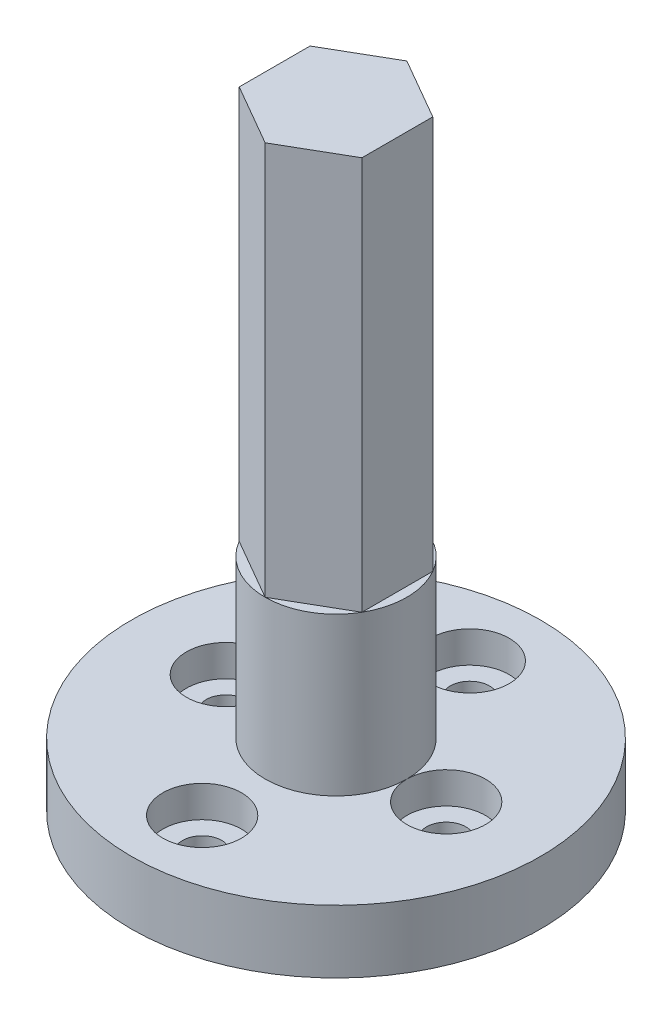
ISO-10303-21;
HEADER;
FILE_DESCRIPTION(('STEP AP214'),'2;1');
FILE_NAME('part.step','',(''),(''),'','','');
FILE_SCHEMA(('AUTOMOTIVE_DESIGN { 1 0 10303 214 1 1 1 1 }'));
ENDSEC;
DATA;
#1=APPLICATION_CONTEXT('core data for automotive mechanical design processes');
#2=APPLICATION_PROTOCOL_DEFINITION('international standard','automotive_design',2000,#1);
#3=PRODUCT_CONTEXT('',#1,'mechanical');
#4=PRODUCT('Part','Part','',(#3));
#5=PRODUCT_RELATED_PRODUCT_CATEGORY('part','',(#4));
#6=PRODUCT_DEFINITION_FORMATION('','',#4);
#7=PRODUCT_DEFINITION_CONTEXT('part definition',#1,'design');
#8=PRODUCT_DEFINITION('design','',#6,#7);
#9=PRODUCT_DEFINITION_SHAPE('','',#8);
#10=(LENGTH_UNIT() NAMED_UNIT(*) SI_UNIT(.MILLI.,.METRE.));
#11=(NAMED_UNIT(*) PLANE_ANGLE_UNIT() SI_UNIT($,.RADIAN.));
#12=(NAMED_UNIT(*) SI_UNIT($,.STERADIAN.) SOLID_ANGLE_UNIT());
#13=UNCERTAINTY_MEASURE_WITH_UNIT(LENGTH_MEASURE(1.E-05),#10,'distance_accuracy_value','');
#14=(GEOMETRIC_REPRESENTATION_CONTEXT(3) GLOBAL_UNCERTAINTY_ASSIGNED_CONTEXT((#13)) GLOBAL_UNIT_ASSIGNED_CONTEXT((#10,
#11,#12)) REPRESENTATION_CONTEXT('',''));
#15=CARTESIAN_POINT('',(0.,0.,0.));
#16=DIRECTION('',(0.,0.,1.));
#17=DIRECTION('',(1.,0.,0.));
#18=AXIS2_PLACEMENT_3D('',#15,#16,#17);
#19=CARTESIAN_POINT('',(0.,39.,0.));
#20=DIRECTION('',(0.,-1.,0.));
#21=DIRECTION('',(0.,0.,-1.));
#22=AXIS2_PLACEMENT_3D('',#19,#20,#21);
#23=CYLINDRICAL_SURFACE('',#22,4.5);
#24=CARTESIAN_POINT('',(0.,4.,0.));
#25=DIRECTION('',(0.,1.,0.));
#26=DIRECTION('',(0.,0.,1.));
#27=AXIS2_PLACEMENT_3D('',#24,#25,#26);
#28=CIRCLE('',#27,4.5);
#29=CARTESIAN_POINT('',(-4.5,4.,0.));
#30=VERTEX_POINT('',#29);
#31=CARTESIAN_POINT('',(4.5,4.,0.));
#32=VERTEX_POINT('',#31);
#33=EDGE_CURVE('E156',#30,#32,#28,.T.);
#34=ORIENTED_EDGE('',*,*,#33,.T.);
#35=EDGE_CURVE('E151',#32,#30,#28,.T.);
#36=ORIENTED_EDGE('',*,*,#35,.T.);
#37=EDGE_LOOP('',(#34,#36));
#38=FACE_BOUND('',#37,.T.);
#39=CARTESIAN_POINT('',(0.,14.,0.));
#40=DIRECTION('',(0.,1.,0.));
#41=DIRECTION('',(0.,0.,1.));
#42=AXIS2_PLACEMENT_3D('',#39,#40,#41);
#43=CIRCLE('',#42,4.5);
#44=CARTESIAN_POINT('',(0.,14.,-4.5));
#45=VERTEX_POINT('',#44);
#46=CARTESIAN_POINT('',(-3.89711431702997,14.,-2.25));
#47=VERTEX_POINT('',#46);
#48=EDGE_CURVE('E12',#45,#47,#43,.T.);
#49=ORIENTED_EDGE('',*,*,#48,.F.);
#50=CARTESIAN_POINT('',(3.89711431702997,14.,-2.25));
#51=VERTEX_POINT('',#50);
#52=EDGE_CURVE('E58',#51,#45,#43,.T.);
#53=ORIENTED_EDGE('',*,*,#52,.F.);
#54=CARTESIAN_POINT('',(3.89711431702997,14.,2.25));
#55=VERTEX_POINT('',#54);
#56=EDGE_CURVE('E117',#55,#51,#43,.T.);
#57=ORIENTED_EDGE('',*,*,#56,.F.);
#58=CARTESIAN_POINT('',(0.,14.,4.5));
#59=VERTEX_POINT('',#58);
#60=EDGE_CURVE('E154',#59,#55,#43,.T.);
#61=ORIENTED_EDGE('',*,*,#60,.F.);
#62=CARTESIAN_POINT('',(-3.89711431702997,14.,2.25));
#63=VERTEX_POINT('',#62);
#64=EDGE_CURVE('E148',#63,#59,#43,.T.);
#65=ORIENTED_EDGE('',*,*,#64,.F.);
#66=EDGE_CURVE('E52',#47,#63,#43,.T.);
#67=ORIENTED_EDGE('',*,*,#66,.F.);
#68=EDGE_LOOP('',(#49,#53,#57,#61,#65,#67));
#69=FACE_BOUND('',#68,.T.);
#70=ADVANCED_FACE('F48',(#38,#69),#23,.T.);
#71=CARTESIAN_POINT('',(0.,4.,0.));
#72=DIRECTION('',(0.,1.,0.));
#73=DIRECTION('',(0.,0.,1.));
#74=AXIS2_PLACEMENT_3D('',#71,#72,#73);
#75=PLANE('',#74);
#76=CARTESIAN_POINT('',(0.,4.,8.5));
#77=DIRECTION('',(0.,1.,0.));
#78=DIRECTION('',(0.,0.,1.));
#79=AXIS2_PLACEMENT_3D('',#76,#77,#78);
#80=CIRCLE('',#79,2.5);
#81=CARTESIAN_POINT('',(0.,4.,11.));
#82=VERTEX_POINT('',#81);
#83=EDGE_CURVE('E201',#82,#82,#80,.F.);
#84=ORIENTED_EDGE('',*,*,#83,.T.);
#85=EDGE_LOOP('',(#84));
#86=FACE_BOUND('',#85,.T.);
#87=CARTESIAN_POINT('',(0.,4.,0.));
#88=DIRECTION('',(0.,1.,0.));
#89=DIRECTION('',(0.,0.,1.));
#90=AXIS2_PLACEMENT_3D('',#87,#88,#89);
#91=CIRCLE('',#90,13.);
#92=CARTESIAN_POINT('',(0.,4.,13.));
#93=VERTEX_POINT('',#92);
#94=EDGE_CURVE('E162',#93,#93,#91,.T.);
#95=ORIENTED_EDGE('',*,*,#94,.T.);
#96=EDGE_LOOP('',(#95));
#97=FACE_BOUND('',#96,.T.);
#98=ORIENTED_EDGE('',*,*,#35,.F.);
#99=CARTESIAN_POINT('',(7.,4.,0.));
#100=DIRECTION('',(0.,1.,0.));
#101=DIRECTION('',(0.,0.,1.));
#102=AXIS2_PLACEMENT_3D('',#99,#100,#101);
#103=CIRCLE('',#102,2.5);
#104=EDGE_CURVE('E165',#32,#32,#103,.F.);
#105=ORIENTED_EDGE('',*,*,#104,.T.);
#106=ORIENTED_EDGE('',*,*,#33,.F.);
#107=CARTESIAN_POINT('',(-7.,4.,0.));
#108=DIRECTION('',(0.,1.,0.));
#109=DIRECTION('',(0.,0.,1.));
#110=AXIS2_PLACEMENT_3D('',#107,#108,#109);
#111=CIRCLE('',#110,2.5);
#112=EDGE_CURVE('E200',#30,#30,#111,.F.);
#113=ORIENTED_EDGE('',*,*,#112,.T.);
#114=EDGE_LOOP('',(#98,#105,#106,#113));
#115=FACE_BOUND('',#114,.T.);
#116=CARTESIAN_POINT('',(0.,4.,-8.5));
#117=DIRECTION('',(0.,1.,0.));
#118=DIRECTION('',(0.,0.,1.));
#119=AXIS2_PLACEMENT_3D('',#116,#117,#118);
#120=CIRCLE('',#119,2.5);
#121=CARTESIAN_POINT('',(0.,4.,-6.));
#122=VERTEX_POINT('',#121);
#123=EDGE_CURVE('E180',#122,#122,#120,.F.);
#124=ORIENTED_EDGE('',*,*,#123,.T.);
#125=EDGE_LOOP('',(#124));
#126=FACE_BOUND('',#125,.T.);
#127=ADVANCED_FACE('F256',(#86,#97,#115,#126),#75,.T.);
#128=CARTESIAN_POINT('',(-7.,39.,0.));
#129=DIRECTION('',(0.,-1.,0.));
#130=DIRECTION('',(0.,0.,-1.));
#131=AXIS2_PLACEMENT_3D('',#128,#129,#130);
#132=CYLINDRICAL_SURFACE('',#131,1.25);
#133=CARTESIAN_POINT('',(-7.,0.,0.));
#134=DIRECTION('',(0.,1.,0.));
#135=DIRECTION('',(0.,0.,1.));
#136=AXIS2_PLACEMENT_3D('',#133,#134,#135);
#137=CIRCLE('',#136,1.25);
#138=CARTESIAN_POINT('',(-7.,0.,1.25));
#139=VERTEX_POINT('',#138);
#140=EDGE_CURVE('E175',#139,#139,#137,.T.);
#141=ORIENTED_EDGE('',*,*,#140,.F.);
#142=EDGE_LOOP('',(#141));
#143=FACE_BOUND('',#142,.T.);
#144=CARTESIAN_POINT('',(-7.,2.,0.));
#145=DIRECTION('',(0.,1.,0.));
#146=DIRECTION('',(0.,0.,1.));
#147=AXIS2_PLACEMENT_3D('',#144,#145,#146);
#148=CIRCLE('',#147,1.25);
#149=CARTESIAN_POINT('',(-7.,2.,1.25));
#150=VERTEX_POINT('',#149);
#151=EDGE_CURVE('E241',#150,#150,#148,.T.);
#152=ORIENTED_EDGE('',*,*,#151,.T.);
#153=EDGE_LOOP('',(#152));
#154=FACE_BOUND('',#153,.T.);
#155=ADVANCED_FACE('F266',(#143,#154),#132,.F.);
#156=CARTESIAN_POINT('',(7.,39.,0.));
#157=DIRECTION('',(0.,-1.,0.));
#158=DIRECTION('',(0.,0.,-1.));
#159=AXIS2_PLACEMENT_3D('',#156,#157,#158);
#160=CYLINDRICAL_SURFACE('',#159,1.25);
#161=CARTESIAN_POINT('',(7.,0.,0.));
#162=DIRECTION('',(0.,1.,0.));
#163=DIRECTION('',(0.,0.,1.));
#164=AXIS2_PLACEMENT_3D('',#161,#162,#163);
#165=CIRCLE('',#164,1.25);
#166=CARTESIAN_POINT('',(7.,0.,1.25));
#167=VERTEX_POINT('',#166);
#168=EDGE_CURVE('E179',#167,#167,#165,.T.);
#169=ORIENTED_EDGE('',*,*,#168,.F.);
#170=EDGE_LOOP('',(#169));
#171=FACE_BOUND('',#170,.T.);
#172=CARTESIAN_POINT('',(7.,2.,0.));
#173=DIRECTION('',(0.,1.,0.));
#174=DIRECTION('',(0.,0.,1.));
#175=AXIS2_PLACEMENT_3D('',#172,#173,#174);
#176=CIRCLE('',#175,1.25);
#177=CARTESIAN_POINT('',(7.,2.,1.25));
#178=VERTEX_POINT('',#177);
#179=EDGE_CURVE('E236',#178,#178,#176,.T.);
#180=ORIENTED_EDGE('',*,*,#179,.T.);
#181=EDGE_LOOP('',(#180));
#182=FACE_BOUND('',#181,.T.);
#183=ADVANCED_FACE('F302',(#171,#182),#160,.F.);
#184=CARTESIAN_POINT('',(0.,39.,-8.5));
#185=DIRECTION('',(0.,-1.,0.));
#186=DIRECTION('',(0.,0.,-1.));
#187=AXIS2_PLACEMENT_3D('',#184,#185,#186);
#188=CYLINDRICAL_SURFACE('',#187,1.25);
#189=CARTESIAN_POINT('',(0.,0.,-8.5));
#190=DIRECTION('',(0.,1.,0.));
#191=DIRECTION('',(0.,0.,1.));
#192=AXIS2_PLACEMENT_3D('',#189,#190,#191);
#193=CIRCLE('',#192,1.25);
#194=CARTESIAN_POINT('',(0.,0.,-7.25));
#195=VERTEX_POINT('',#194);
#196=EDGE_CURVE('E184',#195,#195,#193,.T.);
#197=ORIENTED_EDGE('',*,*,#196,.F.);
#198=EDGE_LOOP('',(#197));
#199=FACE_BOUND('',#198,.T.);
#200=CARTESIAN_POINT('',(0.,2.,-8.5));
#201=DIRECTION('',(0.,1.,0.));
#202=DIRECTION('',(0.,0.,1.));
#203=AXIS2_PLACEMENT_3D('',#200,#201,#202);
#204=CIRCLE('',#203,1.25);
#205=CARTESIAN_POINT('',(0.,2.,-7.25));
#206=VERTEX_POINT('',#205);
#207=EDGE_CURVE('E195',#206,#206,#204,.F.);
#208=ORIENTED_EDGE('',*,*,#207,.F.);
#209=EDGE_LOOP('',(#208));
#210=FACE_BOUND('',#209,.T.);
#211=ADVANCED_FACE('F327',(#199,#210),#188,.F.);
#212=CARTESIAN_POINT('',(0.,39.,8.5));
#213=DIRECTION('',(0.,-1.,0.));
#214=DIRECTION('',(0.,0.,-1.));
#215=AXIS2_PLACEMENT_3D('',#212,#213,#214);
#216=CYLINDRICAL_SURFACE('',#215,1.25);
#217=CARTESIAN_POINT('',(0.,0.,8.5));
#218=DIRECTION('',(0.,1.,0.));
#219=DIRECTION('',(0.,0.,1.));
#220=AXIS2_PLACEMENT_3D('',#217,#218,#219);
#221=CIRCLE('',#220,1.25);
#222=CARTESIAN_POINT('',(0.,0.,9.75));
#223=VERTEX_POINT('',#222);
#224=EDGE_CURVE('E174',#223,#223,#221,.T.);
#225=ORIENTED_EDGE('',*,*,#224,.F.);
#226=EDGE_LOOP('',(#225));
#227=FACE_BOUND('',#226,.T.);
#228=CARTESIAN_POINT('',(0.,2.,8.5));
#229=DIRECTION('',(0.,1.,0.));
#230=DIRECTION('',(0.,0.,1.));
#231=AXIS2_PLACEMENT_3D('',#228,#229,#230);
#232=CIRCLE('',#231,1.25);
#233=CARTESIAN_POINT('',(0.,2.,9.75));
#234=VERTEX_POINT('',#233);
#235=EDGE_CURVE('E191',#234,#234,#232,.F.);
#236=ORIENTED_EDGE('',*,*,#235,.F.);
#237=EDGE_LOOP('',(#236));
#238=FACE_BOUND('',#237,.T.);
#239=ADVANCED_FACE('F285',(#227,#238),#216,.F.);
#240=CARTESIAN_POINT('',(0.,4.,0.));
#241=DIRECTION('',(0.,-1.,0.));
#242=DIRECTION('',(0.,0.,-1.));
#243=AXIS2_PLACEMENT_3D('',#240,#241,#242);
#244=CYLINDRICAL_SURFACE('',#243,13.);
#245=ORIENTED_EDGE('',*,*,#94,.F.);
#246=EDGE_LOOP('',(#245));
#247=FACE_BOUND('',#246,.T.);
#248=CARTESIAN_POINT('',(0.,0.,0.));
#249=DIRECTION('',(0.,1.,0.));
#250=DIRECTION('',(0.,0.,1.));
#251=AXIS2_PLACEMENT_3D('',#248,#249,#250);
#252=CIRCLE('',#251,13.);
#253=CARTESIAN_POINT('',(0.,0.,13.));
#254=VERTEX_POINT('',#253);
#255=EDGE_CURVE('E170',#254,#254,#252,.T.);
#256=ORIENTED_EDGE('',*,*,#255,.T.);
#257=EDGE_LOOP('',(#256));
#258=FACE_BOUND('',#257,.T.);
#259=ADVANCED_FACE('F50',(#247,#258),#244,.T.);
#260=CARTESIAN_POINT('',(0.,0.,0.));
#261=DIRECTION('',(0.,1.,0.));
#262=DIRECTION('',(0.,0.,1.));
#263=AXIS2_PLACEMENT_3D('',#260,#261,#262);
#264=PLANE('',#263);
#265=CARTESIAN_POINT('',(0.,0.,0.));
#266=DIRECTION('',(0.,-1.,0.));
#267=DIRECTION('',(0.,0.,-1.));
#268=AXIS2_PLACEMENT_3D('',#265,#266,#267);
#269=CIRCLE('',#268,4.);
#270=CARTESIAN_POINT('',(0.,0.,-4.));
#271=VERTEX_POINT('',#270);
#272=EDGE_CURVE('E220',#271,#271,#269,.T.);
#273=ORIENTED_EDGE('',*,*,#272,.F.);
#274=EDGE_LOOP('',(#273));
#275=FACE_BOUND('',#274,.T.);
#276=ORIENTED_EDGE('',*,*,#224,.T.);
#277=EDGE_LOOP('',(#276));
#278=FACE_BOUND('',#277,.T.);
#279=ORIENTED_EDGE('',*,*,#196,.T.);
#280=EDGE_LOOP('',(#279));
#281=FACE_BOUND('',#280,.T.);
#282=ORIENTED_EDGE('',*,*,#168,.T.);
#283=EDGE_LOOP('',(#282));
#284=FACE_BOUND('',#283,.T.);
#285=ORIENTED_EDGE('',*,*,#140,.T.);
#286=EDGE_LOOP('',(#285));
#287=FACE_BOUND('',#286,.T.);
#288=ORIENTED_EDGE('',*,*,#255,.F.);
#289=EDGE_LOOP('',(#288));
#290=FACE_BOUND('',#289,.T.);
#291=ADVANCED_FACE('F272',(#275,#278,#281,#284,#287,#290),#264,.F.);
#292=CARTESIAN_POINT('',(0.,2.,8.5));
#293=DIRECTION('',(0.,1.,0.));
#294=DIRECTION('',(0.,0.,1.));
#295=AXIS2_PLACEMENT_3D('',#292,#293,#294);
#296=PLANE('',#295);
#297=CARTESIAN_POINT('',(0.,2.,8.5));
#298=DIRECTION('',(0.,1.,0.));
#299=DIRECTION('',(0.,0.,1.));
#300=AXIS2_PLACEMENT_3D('',#297,#298,#299);
#301=CIRCLE('',#300,2.5);
#302=CARTESIAN_POINT('',(0.,2.,11.));
#303=VERTEX_POINT('',#302);
#304=EDGE_CURVE('E232',#303,#303,#301,.T.);
#305=ORIENTED_EDGE('',*,*,#304,.T.);
#306=EDGE_LOOP('',(#305));
#307=FACE_BOUND('',#306,.T.);
#308=ORIENTED_EDGE('',*,*,#235,.T.);
#309=EDGE_LOOP('',(#308));
#310=FACE_BOUND('',#309,.T.);
#311=ADVANCED_FACE('F274',(#307,#310),#296,.T.);
#312=CARTESIAN_POINT('',(0.,39.,8.5));
#313=DIRECTION('',(0.,-1.,0.));
#314=DIRECTION('',(0.,0.,-1.));
#315=AXIS2_PLACEMENT_3D('',#312,#313,#314);
#316=CYLINDRICAL_SURFACE('',#315,2.5);
#317=ORIENTED_EDGE('',*,*,#83,.F.);
#318=EDGE_LOOP('',(#317));
#319=FACE_BOUND('',#318,.T.);
#320=ORIENTED_EDGE('',*,*,#304,.F.);
#321=EDGE_LOOP('',(#320));
#322=FACE_BOUND('',#321,.T.);
#323=ADVANCED_FACE('F281',(#319,#322),#316,.F.);
#324=CARTESIAN_POINT('',(0.,2.,-8.5));
#325=DIRECTION('',(0.,1.,0.));
#326=DIRECTION('',(0.,0.,1.));
#327=AXIS2_PLACEMENT_3D('',#324,#325,#326);
#328=PLANE('',#327);
#329=CARTESIAN_POINT('',(0.,2.,-8.5));
#330=DIRECTION('',(0.,1.,0.));
#331=DIRECTION('',(0.,0.,1.));
#332=AXIS2_PLACEMENT_3D('',#329,#330,#331);
#333=CIRCLE('',#332,2.5);
#334=CARTESIAN_POINT('',(0.,2.,-6.));
#335=VERTEX_POINT('',#334);
#336=EDGE_CURVE('E196',#335,#335,#333,.T.);
#337=ORIENTED_EDGE('',*,*,#336,.T.);
#338=EDGE_LOOP('',(#337));
#339=FACE_BOUND('',#338,.T.);
#340=ORIENTED_EDGE('',*,*,#207,.T.);
#341=EDGE_LOOP('',(#340));
#342=FACE_BOUND('',#341,.T.);
#343=ADVANCED_FACE('F346',(#339,#342),#328,.T.);
#344=CARTESIAN_POINT('',(0.,39.,-8.5));
#345=DIRECTION('',(0.,-1.,0.));
#346=DIRECTION('',(0.,0.,-1.));
#347=AXIS2_PLACEMENT_3D('',#344,#345,#346);
#348=CYLINDRICAL_SURFACE('',#347,2.5);
#349=ORIENTED_EDGE('',*,*,#123,.F.);
#350=EDGE_LOOP('',(#349));
#351=FACE_BOUND('',#350,.T.);
#352=ORIENTED_EDGE('',*,*,#336,.F.);
#353=EDGE_LOOP('',(#352));
#354=FACE_BOUND('',#353,.T.);
#355=ADVANCED_FACE('F342',(#351,#354),#348,.F.);
#356=CARTESIAN_POINT('',(7.,39.,0.));
#357=DIRECTION('',(0.,-1.,0.));
#358=DIRECTION('',(0.,0.,-1.));
#359=AXIS2_PLACEMENT_3D('',#356,#357,#358);
#360=CYLINDRICAL_SURFACE('',#359,2.5);
#361=ORIENTED_EDGE('',*,*,#104,.F.);
#362=EDGE_LOOP('',(#361));
#363=FACE_BOUND('',#362,.T.);
#364=CARTESIAN_POINT('',(7.,2.,0.));
#365=DIRECTION('',(0.,1.,0.));
#366=DIRECTION('',(0.,0.,1.));
#367=AXIS2_PLACEMENT_3D('',#364,#365,#366);
#368=CIRCLE('',#367,2.5);
#369=CARTESIAN_POINT('',(7.,2.,2.5));
#370=VERTEX_POINT('',#369);
#371=EDGE_CURVE('E237',#370,#370,#368,.T.);
#372=ORIENTED_EDGE('',*,*,#371,.F.);
#373=EDGE_LOOP('',(#372));
#374=FACE_BOUND('',#373,.T.);
#375=ADVANCED_FACE('F320',(#363,#374),#360,.F.);
#376=CARTESIAN_POINT('',(7.,2.,0.));
#377=DIRECTION('',(0.,1.,0.));
#378=DIRECTION('',(0.,0.,1.));
#379=AXIS2_PLACEMENT_3D('',#376,#377,#378);
#380=PLANE('',#379);
#381=ORIENTED_EDGE('',*,*,#179,.F.);
#382=EDGE_LOOP('',(#381));
#383=FACE_BOUND('',#382,.T.);
#384=ORIENTED_EDGE('',*,*,#371,.T.);
#385=EDGE_LOOP('',(#384));
#386=FACE_BOUND('',#385,.T.);
#387=ADVANCED_FACE('F314',(#383,#386),#380,.T.);
#388=CARTESIAN_POINT('',(-7.,39.,0.));
#389=DIRECTION('',(0.,-1.,0.));
#390=DIRECTION('',(0.,0.,-1.));
#391=AXIS2_PLACEMENT_3D('',#388,#389,#390);
#392=CYLINDRICAL_SURFACE('',#391,2.5);
#393=ORIENTED_EDGE('',*,*,#112,.F.);
#394=EDGE_LOOP('',(#393));
#395=FACE_BOUND('',#394,.T.);
#396=CARTESIAN_POINT('',(-7.,2.,0.));
#397=DIRECTION('',(0.,1.,0.));
#398=DIRECTION('',(0.,0.,1.));
#399=AXIS2_PLACEMENT_3D('',#396,#397,#398);
#400=CIRCLE('',#399,2.5);
#401=CARTESIAN_POINT('',(-7.,2.,2.5));
#402=VERTEX_POINT('',#401);
#403=EDGE_CURVE('E217',#402,#402,#400,.T.);
#404=ORIENTED_EDGE('',*,*,#403,.F.);
#405=EDGE_LOOP('',(#404));
#406=FACE_BOUND('',#405,.T.);
#407=ADVANCED_FACE('F309',(#395,#406),#392,.F.);
#408=CARTESIAN_POINT('',(-7.,2.,0.));
#409=DIRECTION('',(0.,1.,0.));
#410=DIRECTION('',(0.,0.,1.));
#411=AXIS2_PLACEMENT_3D('',#408,#409,#410);
#412=PLANE('',#411);
#413=ORIENTED_EDGE('',*,*,#151,.F.);
#414=EDGE_LOOP('',(#413));
#415=FACE_BOUND('',#414,.T.);
#416=ORIENTED_EDGE('',*,*,#403,.T.);
#417=EDGE_LOOP('',(#416));
#418=FACE_BOUND('',#417,.T.);
#419=ADVANCED_FACE('F305',(#415,#418),#412,.T.);
#420=CARTESIAN_POINT('',(0.,0.5,0.));
#421=DIRECTION('',(0.,-1.,0.));
#422=DIRECTION('',(0.,0.,-1.));
#423=AXIS2_PLACEMENT_3D('',#420,#421,#422);
#424=CYLINDRICAL_SURFACE('',#423,4.);
#425=CARTESIAN_POINT('',(0.,0.5,0.));
#426=DIRECTION('',(0.,-1.,0.));
#427=DIRECTION('',(0.,0.,-1.));
#428=AXIS2_PLACEMENT_3D('',#425,#426,#427);
#429=CIRCLE('',#428,4.);
#430=CARTESIAN_POINT('',(0.,0.5,-4.));
#431=VERTEX_POINT('',#430);
#432=EDGE_CURVE('E211',#431,#431,#429,.T.);
#433=ORIENTED_EDGE('',*,*,#432,.F.);
#434=EDGE_LOOP('',(#433));
#435=FACE_BOUND('',#434,.T.);
#436=ORIENTED_EDGE('',*,*,#272,.T.);
#437=EDGE_LOOP('',(#436));
#438=FACE_BOUND('',#437,.T.);
#439=ADVANCED_FACE('F308',(#435,#438),#424,.F.);
#440=CARTESIAN_POINT('',(0.,0.5,0.));
#441=DIRECTION('',(0.,-1.,0.));
#442=DIRECTION('',(0.,0.,-1.));
#443=AXIS2_PLACEMENT_3D('',#440,#441,#442);
#444=PLANE('',#443);
#445=CARTESIAN_POINT('',(0.,0.5,0.));
#446=DIRECTION('',(0.,-1.,0.));
#447=DIRECTION('',(0.,0.,-1.));
#448=AXIS2_PLACEMENT_3D('',#445,#446,#447);
#449=CIRCLE('',#448,1.625);
#450=CARTESIAN_POINT('',(0.,0.5,-1.625));
#451=VERTEX_POINT('',#450);
#452=EDGE_CURVE('E207',#451,#451,#449,.T.);
#453=ORIENTED_EDGE('',*,*,#452,.F.);
#454=EDGE_LOOP('',(#453));
#455=FACE_BOUND('',#454,.T.);
#456=ORIENTED_EDGE('',*,*,#432,.T.);
#457=EDGE_LOOP('',(#456));
#458=FACE_BOUND('',#457,.T.);
#459=ADVANCED_FACE('F362',(#455,#458),#444,.T.);
#460=CARTESIAN_POINT('',(0.,3.,0.));
#461=DIRECTION('',(0.,1.,0.));
#462=DIRECTION('',(0.,0.,1.));
#463=AXIS2_PLACEMENT_3D('',#460,#461,#462);
#464=PLANE('',#463);
#465=CARTESIAN_POINT('',(0.,3.,0.));
#466=DIRECTION('',(0.,1.,0.));
#467=DIRECTION('',(0.,0.,1.));
#468=AXIS2_PLACEMENT_3D('',#465,#466,#467);
#469=CIRCLE('',#468,1.625);
#470=CARTESIAN_POINT('',(0.,3.,1.625));
#471=VERTEX_POINT('',#470);
#472=EDGE_CURVE('E210',#471,#471,#469,.T.);
#473=ORIENTED_EDGE('',*,*,#472,.F.);
#474=EDGE_LOOP('',(#473));
#475=FACE_BOUND('',#474,.T.);
#476=ADVANCED_FACE('F359',(#475),#464,.F.);
#477=CARTESIAN_POINT('',(0.,3.,0.));
#478=DIRECTION('',(0.,-1.,0.));
#479=DIRECTION('',(0.,0.,-1.));
#480=AXIS2_PLACEMENT_3D('',#477,#478,#479);
#481=CYLINDRICAL_SURFACE('',#480,1.625);
#482=ORIENTED_EDGE('',*,*,#472,.T.);
#483=EDGE_LOOP('',(#482));
#484=FACE_BOUND('',#483,.T.);
#485=ORIENTED_EDGE('',*,*,#452,.T.);
#486=EDGE_LOOP('',(#485));
#487=FACE_BOUND('',#486,.T.);
#488=ADVANCED_FACE('F356',(#484,#487),#481,.F.);
#489=CARTESIAN_POINT('',(0.,14.,0.));
#490=DIRECTION('',(0.,1.,0.));
#491=DIRECTION('',(0.,0.,1.));
#492=AXIS2_PLACEMENT_3D('',#489,#490,#491);
#493=PLANE('',#492);
#494=ORIENTED_EDGE('',*,*,#60,.T.);
#495=DIRECTION('',(0.866025403784439,0.,-0.5));
#496=VECTOR('',#495,1.);
#497=CARTESIAN_POINT('',(0.,14.,4.5));
#498=LINE('',#497,#496);
#499=EDGE_CURVE('E433',#59,#55,#498,.T.);
#500=ORIENTED_EDGE('',*,*,#499,.F.);
#501=EDGE_LOOP('',(#494,#500));
#502=FACE_BOUND('',#501,.T.);
#503=ADVANCED_FACE('F358',(#502),#493,.T.);
#504=ORIENTED_EDGE('',*,*,#56,.T.);
#505=DIRECTION('',(0.,0.,-1.));
#506=VECTOR('',#505,1.);
#507=CARTESIAN_POINT('',(3.89711431702997,14.,2.25));
#508=LINE('',#507,#506);
#509=EDGE_CURVE('E133',#55,#51,#508,.T.);
#510=ORIENTED_EDGE('',*,*,#509,.F.);
#511=EDGE_LOOP('',(#504,#510));
#512=FACE_BOUND('',#511,.T.);
#513=ADVANCED_FACE('F370',(#512),#493,.T.);
#514=ORIENTED_EDGE('',*,*,#52,.T.);
#515=DIRECTION('',(-0.866025403784439,0.,-0.499999999999999));
#516=VECTOR('',#515,1.);
#517=CARTESIAN_POINT('',(3.89711431702997,14.,-2.25));
#518=LINE('',#517,#516);
#519=EDGE_CURVE('E111',#51,#45,#518,.T.);
#520=ORIENTED_EDGE('',*,*,#519,.F.);
#521=EDGE_LOOP('',(#514,#520));
#522=FACE_BOUND('',#521,.T.);
#523=ADVANCED_FACE('F109',(#522),#493,.T.);
#524=ORIENTED_EDGE('',*,*,#48,.T.);
#525=DIRECTION('',(-0.866025403784439,0.,0.5));
#526=VECTOR('',#525,1.);
#527=CARTESIAN_POINT('',(0.,14.,-4.5));
#528=LINE('',#527,#526);
#529=EDGE_CURVE('E124',#45,#47,#528,.T.);
#530=ORIENTED_EDGE('',*,*,#529,.F.);
#531=EDGE_LOOP('',(#524,#530));
#532=FACE_BOUND('',#531,.T.);
#533=ADVANCED_FACE('F136',(#532),#493,.T.);
#534=ORIENTED_EDGE('',*,*,#66,.T.);
#535=DIRECTION('',(0.,0.,1.));
#536=VECTOR('',#535,1.);
#537=CARTESIAN_POINT('',(-3.89711431702997,14.,-2.25));
#538=LINE('',#537,#536);
#539=EDGE_CURVE('E65',#47,#63,#538,.T.);
#540=ORIENTED_EDGE('',*,*,#539,.F.);
#541=EDGE_LOOP('',(#534,#540));
#542=FACE_BOUND('',#541,.T.);
#543=ADVANCED_FACE('F455',(#542),#493,.T.);
#544=ORIENTED_EDGE('',*,*,#64,.T.);
#545=DIRECTION('',(0.866025403784439,0.,0.5));
#546=VECTOR('',#545,1.);
#547=CARTESIAN_POINT('',(-3.89711431702997,14.,2.25));
#548=LINE('',#547,#546);
#549=EDGE_CURVE('E437',#63,#59,#548,.T.);
#550=ORIENTED_EDGE('',*,*,#549,.F.);
#551=EDGE_LOOP('',(#544,#550));
#552=FACE_BOUND('',#551,.T.);
#553=ADVANCED_FACE('F372',(#552),#493,.T.);
#554=CARTESIAN_POINT('',(3.89711431702997,14.,-2.25));
#555=DIRECTION('',(0.499999999999999,0.,-0.866025403784439));
#556=DIRECTION('',(-0.866025403784439,0.,-0.5));
#557=AXIS2_PLACEMENT_3D('',#554,#555,#556);
#558=PLANE('',#557);
#559=DIRECTION('',(-0.866025403784439,0.,-0.499999999999999));
#560=VECTOR('',#559,1.);
#561=CARTESIAN_POINT('',(3.89711431702997,39.,-2.25));
#562=LINE('',#561,#560);
#563=CARTESIAN_POINT('',(3.89711431702997,39.,-2.25));
#564=VERTEX_POINT('',#563);
#565=CARTESIAN_POINT('',(0.,39.,-4.5));
#566=VERTEX_POINT('',#565);
#567=EDGE_CURVE('E424',#564,#566,#562,.T.);
#568=ORIENTED_EDGE('',*,*,#567,.F.);
#569=DIRECTION('',(0.,1.,0.));
#570=VECTOR('',#569,1.);
#571=CARTESIAN_POINT('',(3.89711431702997,14.,-2.25));
#572=LINE('',#571,#570);
#573=EDGE_CURVE('E141',#51,#564,#572,.T.);
#574=ORIENTED_EDGE('',*,*,#573,.F.);
#575=ORIENTED_EDGE('',*,*,#519,.T.);
#576=DIRECTION('',(0.,1.,0.));
#577=VECTOR('',#576,1.);
#578=CARTESIAN_POINT('',(0.,14.,-4.5));
#579=LINE('',#578,#577);
#580=EDGE_CURVE('E121',#45,#566,#579,.T.);
#581=ORIENTED_EDGE('',*,*,#580,.T.);
#582=EDGE_LOOP('',(#568,#574,#575,#581));
#583=FACE_BOUND('',#582,.T.);
#584=ADVANCED_FACE('F140',(#583),#558,.T.);
#585=CARTESIAN_POINT('',(3.89711431702997,14.,2.25));
#586=DIRECTION('',(1.,0.,0.));
#587=DIRECTION('',(0.,0.,-1.));
#588=AXIS2_PLACEMENT_3D('',#585,#586,#587);
#589=PLANE('',#588);
#590=DIRECTION('',(0.,0.,-1.));
#591=VECTOR('',#590,1.);
#592=CARTESIAN_POINT('',(3.89711431702997,39.,2.25));
#593=LINE('',#592,#591);
#594=CARTESIAN_POINT('',(3.89711431702997,39.,2.25));
#595=VERTEX_POINT('',#594);
#596=EDGE_CURVE('E143',#595,#564,#593,.T.);
#597=ORIENTED_EDGE('',*,*,#596,.F.);
#598=DIRECTION('',(0.,1.,0.));
#599=VECTOR('',#598,1.);
#600=CARTESIAN_POINT('',(3.89711431702997,14.,2.25));
#601=LINE('',#600,#599);
#602=EDGE_CURVE('E397',#55,#595,#601,.T.);
#603=ORIENTED_EDGE('',*,*,#602,.F.);
#604=ORIENTED_EDGE('',*,*,#509,.T.);
#605=ORIENTED_EDGE('',*,*,#573,.T.);
#606=EDGE_LOOP('',(#597,#603,#604,#605));
#607=FACE_BOUND('',#606,.T.);
#608=ADVANCED_FACE('F375',(#607),#589,.T.);
#609=CARTESIAN_POINT('',(0.,14.,4.5));
#610=DIRECTION('',(0.5,0.,0.866025403784439));
#611=DIRECTION('',(0.866025403784439,0.,-0.5));
#612=AXIS2_PLACEMENT_3D('',#609,#610,#611);
#613=PLANE('',#612);
#614=DIRECTION('',(0.866025403784439,0.,-0.5));
#615=VECTOR('',#614,1.);
#616=CARTESIAN_POINT('',(0.,39.,4.5));
#617=LINE('',#616,#615);
#618=CARTESIAN_POINT('',(0.,39.,4.5));
#619=VERTEX_POINT('',#618);
#620=EDGE_CURVE('E401',#619,#595,#617,.T.);
#621=ORIENTED_EDGE('',*,*,#620,.F.);
#622=DIRECTION('',(0.,1.,0.));
#623=VECTOR('',#622,1.);
#624=CARTESIAN_POINT('',(0.,14.,4.5));
#625=LINE('',#624,#623);
#626=EDGE_CURVE('E418',#59,#619,#625,.T.);
#627=ORIENTED_EDGE('',*,*,#626,.F.);
#628=ORIENTED_EDGE('',*,*,#499,.T.);
#629=ORIENTED_EDGE('',*,*,#602,.T.);
#630=EDGE_LOOP('',(#621,#627,#628,#629));
#631=FACE_BOUND('',#630,.T.);
#632=ADVANCED_FACE('F384',(#631),#613,.T.);
#633=CARTESIAN_POINT('',(-3.89711431702997,14.,2.25));
#634=DIRECTION('',(-0.5,0.,0.866025403784439));
#635=DIRECTION('',(0.866025403784439,0.,0.5));
#636=AXIS2_PLACEMENT_3D('',#633,#634,#635);
#637=PLANE('',#636);
#638=DIRECTION('',(0.866025403784439,0.,0.5));
#639=VECTOR('',#638,1.);
#640=CARTESIAN_POINT('',(-3.89711431702997,39.,2.25));
#641=LINE('',#640,#639);
#642=CARTESIAN_POINT('',(-3.89711431702997,39.,2.25));
#643=VERTEX_POINT('',#642);
#644=EDGE_CURVE('E406',#643,#619,#641,.T.);
#645=ORIENTED_EDGE('',*,*,#644,.F.);
#646=DIRECTION('',(0.,1.,0.));
#647=VECTOR('',#646,1.);
#648=CARTESIAN_POINT('',(-3.89711431702997,14.,2.25));
#649=LINE('',#648,#647);
#650=EDGE_CURVE('E421',#63,#643,#649,.T.);
#651=ORIENTED_EDGE('',*,*,#650,.F.);
#652=ORIENTED_EDGE('',*,*,#549,.T.);
#653=ORIENTED_EDGE('',*,*,#626,.T.);
#654=EDGE_LOOP('',(#645,#651,#652,#653));
#655=FACE_BOUND('',#654,.T.);
#656=ADVANCED_FACE('F381',(#655),#637,.T.);
#657=CARTESIAN_POINT('',(-3.89711431702997,14.,-2.25));
#658=DIRECTION('',(-1.,0.,0.));
#659=DIRECTION('',(0.,0.,1.));
#660=AXIS2_PLACEMENT_3D('',#657,#658,#659);
#661=PLANE('',#660);
#662=DIRECTION('',(0.,0.,1.));
#663=VECTOR('',#662,1.);
#664=CARTESIAN_POINT('',(-3.89711431702997,39.,-2.25));
#665=LINE('',#664,#663);
#666=CARTESIAN_POINT('',(-3.89711431702997,39.,-2.25));
#667=VERTEX_POINT('',#666);
#668=EDGE_CURVE('E70',#667,#643,#665,.T.);
#669=ORIENTED_EDGE('',*,*,#668,.F.);
#670=DIRECTION('',(0.,1.,0.));
#671=VECTOR('',#670,1.);
#672=CARTESIAN_POINT('',(-3.89711431702997,14.,-2.25));
#673=LINE('',#672,#671);
#674=EDGE_CURVE('E132',#47,#667,#673,.T.);
#675=ORIENTED_EDGE('',*,*,#674,.F.);
#676=ORIENTED_EDGE('',*,*,#539,.T.);
#677=ORIENTED_EDGE('',*,*,#650,.T.);
#678=EDGE_LOOP('',(#669,#675,#676,#677));
#679=FACE_BOUND('',#678,.T.);
#680=ADVANCED_FACE('F378',(#679),#661,.T.);
#681=CARTESIAN_POINT('',(0.,14.,-4.5));
#682=DIRECTION('',(-0.5,0.,-0.866025403784439));
#683=DIRECTION('',(-0.866025403784439,0.,0.5));
#684=AXIS2_PLACEMENT_3D('',#681,#682,#683);
#685=PLANE('',#684);
#686=DIRECTION('',(-0.866025403784439,0.,0.5));
#687=VECTOR('',#686,1.);
#688=CARTESIAN_POINT('',(0.,39.,-4.5));
#689=LINE('',#688,#687);
#690=EDGE_CURVE('E127',#566,#667,#689,.T.);
#691=ORIENTED_EDGE('',*,*,#690,.F.);
#692=ORIENTED_EDGE('',*,*,#580,.F.);
#693=ORIENTED_EDGE('',*,*,#529,.T.);
#694=ORIENTED_EDGE('',*,*,#674,.T.);
#695=EDGE_LOOP('',(#691,#692,#693,#694));
#696=FACE_BOUND('',#695,.T.);
#697=ADVANCED_FACE('F123',(#696),#685,.T.);
#698=CARTESIAN_POINT('',(0.,39.,0.));
#699=DIRECTION('',(0.,1.,0.));
#700=DIRECTION('',(0.,0.,1.));
#701=AXIS2_PLACEMENT_3D('',#698,#699,#700);
#702=PLANE('',#701);
#703=ORIENTED_EDGE('',*,*,#596,.T.);
#704=ORIENTED_EDGE('',*,*,#567,.T.);
#705=ORIENTED_EDGE('',*,*,#690,.T.);
#706=ORIENTED_EDGE('',*,*,#668,.T.);
#707=ORIENTED_EDGE('',*,*,#644,.T.);
#708=ORIENTED_EDGE('',*,*,#620,.T.);
#709=EDGE_LOOP('',(#703,#704,#705,#706,#707,#708));
#710=FACE_BOUND('',#709,.T.);
#711=ADVANCED_FACE('F270',(#710),#702,.T.);
#712=CLOSED_SHELL('',(#70,#127,#155,#183,#211,#239,#259,#291,#311,#323,#343,#355,#375,#387,#407,
#419,#439,#459,#476,#488,#503,#513,#523,#533,#543,#553,#584,#608,#632,#656,#680,#697,#711));
#713=MANIFOLD_SOLID_BREP('B2',#712);
#714=ADVANCED_BREP_SHAPE_REPRESENTATION('',(#18,#713),#14);
#715=SHAPE_DEFINITION_REPRESENTATION(#9,#714);
ENDSEC;
END-ISO-10303-21;
